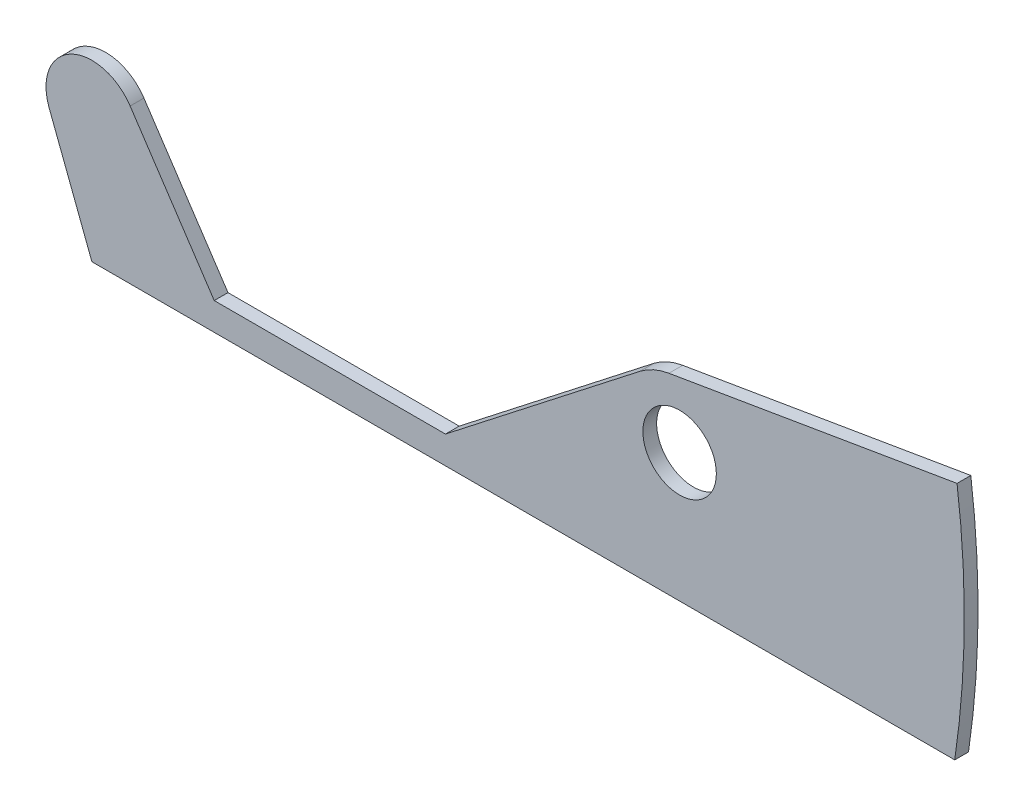
ISO-10303-21;
HEADER;
FILE_DESCRIPTION(('STEP AP214'),'2;1');
FILE_NAME('part.step','',(''),(''),'','','');
FILE_SCHEMA(('AUTOMOTIVE_DESIGN { 1 0 10303 214 1 1 1 1 }'));
ENDSEC;
DATA;
#1=APPLICATION_CONTEXT('core data for automotive mechanical design processes');
#2=APPLICATION_PROTOCOL_DEFINITION('international standard','automotive_design',2000,#1);
#3=PRODUCT_CONTEXT('',#1,'mechanical');
#4=PRODUCT('Part','Part','',(#3));
#5=PRODUCT_RELATED_PRODUCT_CATEGORY('part','',(#4));
#6=PRODUCT_DEFINITION_FORMATION('','',#4);
#7=PRODUCT_DEFINITION_CONTEXT('part definition',#1,'design');
#8=PRODUCT_DEFINITION('design','',#6,#7);
#9=PRODUCT_DEFINITION_SHAPE('','',#8);
#10=(LENGTH_UNIT() NAMED_UNIT(*) SI_UNIT(.MILLI.,.METRE.));
#11=(NAMED_UNIT(*) PLANE_ANGLE_UNIT() SI_UNIT($,.RADIAN.));
#12=(NAMED_UNIT(*) SI_UNIT($,.STERADIAN.) SOLID_ANGLE_UNIT());
#13=UNCERTAINTY_MEASURE_WITH_UNIT(LENGTH_MEASURE(1.E-05),#10,'distance_accuracy_value','');
#14=(GEOMETRIC_REPRESENTATION_CONTEXT(3) GLOBAL_UNCERTAINTY_ASSIGNED_CONTEXT((#13)) GLOBAL_UNIT_ASSIGNED_CONTEXT((#10,
#11,#12)) REPRESENTATION_CONTEXT('',''));
#15=CARTESIAN_POINT('',(0.,0.,0.));
#16=DIRECTION('',(0.,0.,1.));
#17=DIRECTION('',(1.,0.,0.));
#18=AXIS2_PLACEMENT_3D('',#15,#16,#17);
#19=CARTESIAN_POINT('',(0.,0.,3.));
#20=DIRECTION('',(0.,0.,1.));
#21=DIRECTION('',(1.,0.,0.));
#22=AXIS2_PLACEMENT_3D('',#19,#20,#21);
#23=PLANE('',#22);
#24=CARTESIAN_POINT('',(0.,0.,3.));
#25=DIRECTION('',(0.,0.,1.));
#26=DIRECTION('',(1.,0.,0.));
#27=AXIS2_PLACEMENT_3D('',#24,#25,#26);
#28=CIRCLE('',#27,10.);
#29=CARTESIAN_POINT('',(8.32658342257578,5.53787039455478,3.));
#30=VERTEX_POINT('',#29);
#31=CARTESIAN_POINT('',(-9.34049773615859,-3.57142857142857,3.));
#32=VERTEX_POINT('',#31);
#33=EDGE_CURVE('E155',#30,#32,#28,.T.);
#34=ORIENTED_EDGE('',*,*,#33,.T.);
#35=DIRECTION('',(0.357142857142857,-0.934049773615859,0.));
#36=VECTOR('',#35,1.);
#37=CARTESIAN_POINT('',(-9.34049773615859,-3.57142857142857,3.));
#38=LINE('',#37,#36);
#39=CARTESIAN_POINT('',(0.,-28.,3.));
#40=VERTEX_POINT('',#39);
#41=EDGE_CURVE('E98',#32,#40,#38,.T.);
#42=ORIENTED_EDGE('',*,*,#41,.T.);
#43=DIRECTION('',(1.,0.,0.));
#44=VECTOR('',#43,1.);
#45=CARTESIAN_POINT('',(0.,-28.,3.));
#46=LINE('',#45,#44);
#47=CARTESIAN_POINT('',(187.92551716039,-28.,3.));
#48=VERTEX_POINT('',#47);
#49=EDGE_CURVE('E173',#40,#48,#46,.T.);
#50=ORIENTED_EDGE('',*,*,#49,.T.);
#51=CARTESIAN_POINT('',(0.,0.,3.));
#52=DIRECTION('',(0.,0.,1.));
#53=DIRECTION('',(1.,0.,0.));
#54=AXIS2_PLACEMENT_3D('',#51,#52,#53);
#55=CIRCLE('',#54,190.);
#56=CARTESIAN_POINT('',(188.425560886423,24.409178696484,3.));
#57=VERTEX_POINT('',#56);
#58=EDGE_CURVE('E190',#48,#57,#55,.T.);
#59=ORIENTED_EDGE('',*,*,#58,.T.);
#60=DIRECTION('',(-0.986021549791121,-0.166617836222647,0.));
#61=VECTOR('',#60,1.);
#62=CARTESIAN_POINT('',(125.667350292883,13.8043016970757,3.));
#63=LINE('',#62,#61);
#64=CARTESIAN_POINT('',(125.667350292883,13.8043016970757,3.));
#65=VERTEX_POINT('',#64);
#66=EDGE_CURVE('E189',#57,#65,#63,.T.);
#67=ORIENTED_EDGE('',*,*,#66,.T.);
#68=CARTESIAN_POINT('',(128.,0.,3.));
#69=DIRECTION('',(0.,0.,1.));
#70=DIRECTION('',(1.,0.,0.));
#71=AXIS2_PLACEMENT_3D('',#68,#69,#70);
#72=CIRCLE('',#71,14.);
#73=CARTESIAN_POINT('',(119.393575063448,11.0421668983714,3.));
#74=VERTEX_POINT('',#73);
#75=EDGE_CURVE('E120',#65,#74,#72,.T.);
#76=ORIENTED_EDGE('',*,*,#75,.T.);
#77=DIRECTION('',(-0.78872620702653,-0.61474463832517,0.));
#78=VECTOR('',#77,1.);
#79=CARTESIAN_POINT('',(119.393575063448,11.0421668983714,3.));
#80=LINE('',#79,#78);
#81=CARTESIAN_POINT('',(77.,-22.,3.));
#82=VERTEX_POINT('',#81);
#83=EDGE_CURVE('E114',#74,#82,#80,.T.);
#84=ORIENTED_EDGE('',*,*,#83,.T.);
#85=DIRECTION('',(-1.,0.,0.));
#86=VECTOR('',#85,1.);
#87=CARTESIAN_POINT('',(77.,-22.,3.));
#88=LINE('',#87,#86);
#89=CARTESIAN_POINT('',(26.641557217664,-22.,3.));
#90=VERTEX_POINT('',#89);
#91=EDGE_CURVE('E118',#82,#90,#88,.T.);
#92=ORIENTED_EDGE('',*,*,#91,.T.);
#93=DIRECTION('',(-0.553787039455478,0.832658342257577,0.));
#94=VECTOR('',#93,1.);
#95=CARTESIAN_POINT('',(8.32658342257578,5.53787039455478,3.));
#96=LINE('',#95,#94);
#97=EDGE_CURVE('E52',#90,#30,#96,.T.);
#98=ORIENTED_EDGE('',*,*,#97,.T.);
#99=EDGE_LOOP('',(#34,#42,#50,#59,#67,#76,#84,#92,#98));
#100=FACE_BOUND('',#99,.T.);
#101=CARTESIAN_POINT('',(128.,0.,3.));
#102=DIRECTION('',(0.,0.,1.));
#103=DIRECTION('',(1.,0.,0.));
#104=AXIS2_PLACEMENT_3D('',#101,#102,#103);
#105=CIRCLE('',#104,8.00000000000001);
#106=CARTESIAN_POINT('',(136.,0.,3.));
#107=VERTEX_POINT('',#106);
#108=EDGE_CURVE('E142',#107,#107,#105,.T.);
#109=ORIENTED_EDGE('',*,*,#108,.F.);
#110=EDGE_LOOP('',(#109));
#111=FACE_BOUND('',#110,.T.);
#112=ADVANCED_FACE('F35',(#100,#111),#23,.T.);
#113=CARTESIAN_POINT('',(0.,0.,0.));
#114=DIRECTION('',(0.,0.,1.));
#115=DIRECTION('',(1.,0.,0.));
#116=AXIS2_PLACEMENT_3D('',#113,#114,#115);
#117=PLANE('',#116);
#118=CARTESIAN_POINT('',(0.,0.,0.));
#119=DIRECTION('',(0.,0.,1.));
#120=DIRECTION('',(1.,0.,0.));
#121=AXIS2_PLACEMENT_3D('',#118,#119,#120);
#122=CIRCLE('',#121,10.);
#123=CARTESIAN_POINT('',(8.32658342257578,5.53787039455478,0.));
#124=VERTEX_POINT('',#123);
#125=CARTESIAN_POINT('',(-9.34049773615859,-3.57142857142857,0.));
#126=VERTEX_POINT('',#125);
#127=EDGE_CURVE('E138',#124,#126,#122,.T.);
#128=ORIENTED_EDGE('',*,*,#127,.F.);
#129=DIRECTION('',(-0.553787039455478,0.832658342257577,0.));
#130=VECTOR('',#129,1.);
#131=CARTESIAN_POINT('',(8.32658342257578,5.53787039455478,0.));
#132=LINE('',#131,#130);
#133=CARTESIAN_POINT('',(26.641557217664,-22.,0.));
#134=VERTEX_POINT('',#133);
#135=EDGE_CURVE('E90',#134,#124,#132,.T.);
#136=ORIENTED_EDGE('',*,*,#135,.F.);
#137=DIRECTION('',(-1.,0.,0.));
#138=VECTOR('',#137,1.);
#139=CARTESIAN_POINT('',(77.,-22.,0.));
#140=LINE('',#139,#138);
#141=CARTESIAN_POINT('',(77.,-22.,0.));
#142=VERTEX_POINT('',#141);
#143=EDGE_CURVE('E84',#142,#134,#140,.T.);
#144=ORIENTED_EDGE('',*,*,#143,.F.);
#145=DIRECTION('',(-0.78872620702653,-0.61474463832517,0.));
#146=VECTOR('',#145,1.);
#147=CARTESIAN_POINT('',(119.393575063448,11.0421668983714,0.));
#148=LINE('',#147,#146);
#149=CARTESIAN_POINT('',(119.393575063448,11.0421668983714,0.));
#150=VERTEX_POINT('',#149);
#151=EDGE_CURVE('E128',#150,#142,#148,.T.);
#152=ORIENTED_EDGE('',*,*,#151,.F.);
#153=CARTESIAN_POINT('',(128.,0.,0.));
#154=DIRECTION('',(0.,0.,1.));
#155=DIRECTION('',(1.,0.,0.));
#156=AXIS2_PLACEMENT_3D('',#153,#154,#155);
#157=CIRCLE('',#156,14.);
#158=CARTESIAN_POINT('',(125.667350292883,13.8043016970757,0.));
#159=VERTEX_POINT('',#158);
#160=EDGE_CURVE('E150',#159,#150,#157,.T.);
#161=ORIENTED_EDGE('',*,*,#160,.F.);
#162=DIRECTION('',(-0.986021549791121,-0.166617836222647,0.));
#163=VECTOR('',#162,1.);
#164=CARTESIAN_POINT('',(125.667350292883,13.8043016970757,0.));
#165=LINE('',#164,#163);
#166=CARTESIAN_POINT('',(188.425560886423,24.409178696484,0.));
#167=VERTEX_POINT('',#166);
#168=EDGE_CURVE('E148',#167,#159,#165,.T.);
#169=ORIENTED_EDGE('',*,*,#168,.F.);
#170=CARTESIAN_POINT('',(0.,0.,0.));
#171=DIRECTION('',(0.,0.,1.));
#172=DIRECTION('',(1.,0.,0.));
#173=AXIS2_PLACEMENT_3D('',#170,#171,#172);
#174=CIRCLE('',#173,190.);
#175=CARTESIAN_POINT('',(187.92551716039,-28.,0.));
#176=VERTEX_POINT('',#175);
#177=EDGE_CURVE('E146',#176,#167,#174,.T.);
#178=ORIENTED_EDGE('',*,*,#177,.F.);
#179=DIRECTION('',(1.,0.,0.));
#180=VECTOR('',#179,1.);
#181=CARTESIAN_POINT('',(0.,-28.,0.));
#182=LINE('',#181,#180);
#183=CARTESIAN_POINT('',(0.,-28.,0.));
#184=VERTEX_POINT('',#183);
#185=EDGE_CURVE('E144',#184,#176,#182,.T.);
#186=ORIENTED_EDGE('',*,*,#185,.F.);
#187=DIRECTION('',(0.357142857142857,-0.934049773615859,0.));
#188=VECTOR('',#187,1.);
#189=CARTESIAN_POINT('',(-9.34049773615859,-3.57142857142857,0.));
#190=LINE('',#189,#188);
#191=EDGE_CURVE('E141',#126,#184,#190,.T.);
#192=ORIENTED_EDGE('',*,*,#191,.F.);
#193=EDGE_LOOP('',(#128,#136,#144,#152,#161,#169,#178,#186,#192));
#194=FACE_BOUND('',#193,.T.);
#195=CARTESIAN_POINT('',(128.,0.,0.));
#196=DIRECTION('',(0.,0.,1.));
#197=DIRECTION('',(1.,0.,0.));
#198=AXIS2_PLACEMENT_3D('',#195,#196,#197);
#199=CIRCLE('',#198,8.00000000000001);
#200=CARTESIAN_POINT('',(136.,0.,0.));
#201=VERTEX_POINT('',#200);
#202=EDGE_CURVE('E197',#201,#201,#199,.T.);
#203=ORIENTED_EDGE('',*,*,#202,.T.);
#204=EDGE_LOOP('',(#203));
#205=FACE_BOUND('',#204,.T.);
#206=ADVANCED_FACE('F177',(#194,#205),#117,.F.);
#207=CARTESIAN_POINT('',(0.,0.,3.));
#208=DIRECTION('',(0.,0.,-1.));
#209=DIRECTION('',(-1.,0.,0.));
#210=AXIS2_PLACEMENT_3D('',#207,#208,#209);
#211=CYLINDRICAL_SURFACE('',#210,10.);
#212=ORIENTED_EDGE('',*,*,#127,.T.);
#213=DIRECTION('',(0.,0.,-1.));
#214=VECTOR('',#213,1.);
#215=CARTESIAN_POINT('',(-9.34049773615859,-3.57142857142857,3.));
#216=LINE('',#215,#214);
#217=EDGE_CURVE('E11',#32,#126,#216,.T.);
#218=ORIENTED_EDGE('',*,*,#217,.F.);
#219=ORIENTED_EDGE('',*,*,#33,.F.);
#220=DIRECTION('',(0.,0.,-1.));
#221=VECTOR('',#220,1.);
#222=CARTESIAN_POINT('',(8.32658342257578,5.53787039455478,3.));
#223=LINE('',#222,#221);
#224=EDGE_CURVE('E134',#30,#124,#223,.T.);
#225=ORIENTED_EDGE('',*,*,#224,.T.);
#226=EDGE_LOOP('',(#212,#218,#219,#225));
#227=FACE_BOUND('',#226,.T.);
#228=ADVANCED_FACE('F37',(#227),#211,.T.);
#229=CARTESIAN_POINT('',(-9.34049773615859,-3.57142857142857,3.));
#230=DIRECTION('',(0.934049773615859,0.357142857142857,0.));
#231=DIRECTION('',(-0.357142857142857,0.934049773615859,0.));
#232=AXIS2_PLACEMENT_3D('',#229,#230,#231);
#233=PLANE('',#232);
#234=ORIENTED_EDGE('',*,*,#191,.T.);
#235=DIRECTION('',(0.,0.,-1.));
#236=VECTOR('',#235,1.);
#237=CARTESIAN_POINT('',(0.,-28.,3.));
#238=LINE('',#237,#236);
#239=EDGE_CURVE('E44',#40,#184,#238,.T.);
#240=ORIENTED_EDGE('',*,*,#239,.F.);
#241=ORIENTED_EDGE('',*,*,#41,.F.);
#242=ORIENTED_EDGE('',*,*,#217,.T.);
#243=EDGE_LOOP('',(#234,#240,#241,#242));
#244=FACE_BOUND('',#243,.T.);
#245=ADVANCED_FACE('F229',(#244),#233,.F.);
#246=CARTESIAN_POINT('',(0.,-28.,3.));
#247=DIRECTION('',(0.,1.,0.));
#248=DIRECTION('',(0.,0.,1.));
#249=AXIS2_PLACEMENT_3D('',#246,#247,#248);
#250=PLANE('',#249);
#251=ORIENTED_EDGE('',*,*,#185,.T.);
#252=DIRECTION('',(0.,0.,-1.));
#253=VECTOR('',#252,1.);
#254=CARTESIAN_POINT('',(187.92551716039,-28.,3.));
#255=LINE('',#254,#253);
#256=EDGE_CURVE('E165',#48,#176,#255,.T.);
#257=ORIENTED_EDGE('',*,*,#256,.F.);
#258=ORIENTED_EDGE('',*,*,#49,.F.);
#259=ORIENTED_EDGE('',*,*,#239,.T.);
#260=EDGE_LOOP('',(#251,#257,#258,#259));
#261=FACE_BOUND('',#260,.T.);
#262=ADVANCED_FACE('F171',(#261),#250,.F.);
#263=CARTESIAN_POINT('',(0.,0.,3.));
#264=DIRECTION('',(0.,0.,-1.));
#265=DIRECTION('',(-1.,0.,0.));
#266=AXIS2_PLACEMENT_3D('',#263,#264,#265);
#267=CYLINDRICAL_SURFACE('',#266,190.);
#268=ORIENTED_EDGE('',*,*,#177,.T.);
#269=DIRECTION('',(0.,0.,-1.));
#270=VECTOR('',#269,1.);
#271=CARTESIAN_POINT('',(188.425560886423,24.409178696484,3.));
#272=LINE('',#271,#270);
#273=EDGE_CURVE('E162',#57,#167,#272,.T.);
#274=ORIENTED_EDGE('',*,*,#273,.F.);
#275=ORIENTED_EDGE('',*,*,#58,.F.);
#276=ORIENTED_EDGE('',*,*,#256,.T.);
#277=EDGE_LOOP('',(#268,#274,#275,#276));
#278=FACE_BOUND('',#277,.T.);
#279=ADVANCED_FACE('F183',(#278),#267,.T.);
#280=CARTESIAN_POINT('',(125.667350292883,13.8043016970757,3.));
#281=DIRECTION('',(0.166617836222647,-0.986021549791121,0.));
#282=DIRECTION('',(0.986021549791121,0.166617836222647,0.));
#283=AXIS2_PLACEMENT_3D('',#280,#281,#282);
#284=PLANE('',#283);
#285=ORIENTED_EDGE('',*,*,#168,.T.);
#286=DIRECTION('',(0.,0.,-1.));
#287=VECTOR('',#286,1.);
#288=CARTESIAN_POINT('',(125.667350292883,13.8043016970757,3.));
#289=LINE('',#288,#287);
#290=EDGE_CURVE('E159',#65,#159,#289,.T.);
#291=ORIENTED_EDGE('',*,*,#290,.F.);
#292=ORIENTED_EDGE('',*,*,#66,.F.);
#293=ORIENTED_EDGE('',*,*,#273,.T.);
#294=EDGE_LOOP('',(#285,#291,#292,#293));
#295=FACE_BOUND('',#294,.T.);
#296=ADVANCED_FACE('F187',(#295),#284,.F.);
#297=CARTESIAN_POINT('',(128.,0.,3.));
#298=DIRECTION('',(0.,0.,-1.));
#299=DIRECTION('',(-1.,0.,0.));
#300=AXIS2_PLACEMENT_3D('',#297,#298,#299);
#301=CYLINDRICAL_SURFACE('',#300,14.);
#302=ORIENTED_EDGE('',*,*,#160,.T.);
#303=DIRECTION('',(0.,0.,-1.));
#304=VECTOR('',#303,1.);
#305=CARTESIAN_POINT('',(119.393575063448,11.0421668983714,3.));
#306=LINE('',#305,#304);
#307=EDGE_CURVE('E129',#74,#150,#306,.T.);
#308=ORIENTED_EDGE('',*,*,#307,.F.);
#309=ORIENTED_EDGE('',*,*,#75,.F.);
#310=ORIENTED_EDGE('',*,*,#290,.T.);
#311=EDGE_LOOP('',(#302,#308,#309,#310));
#312=FACE_BOUND('',#311,.T.);
#313=ADVANCED_FACE('F220',(#312),#301,.T.);
#314=CARTESIAN_POINT('',(119.393575063448,11.0421668983714,3.));
#315=DIRECTION('',(0.61474463832517,-0.78872620702653,0.));
#316=DIRECTION('',(0.78872620702653,0.61474463832517,0.));
#317=AXIS2_PLACEMENT_3D('',#314,#315,#316);
#318=PLANE('',#317);
#319=ORIENTED_EDGE('',*,*,#151,.T.);
#320=DIRECTION('',(0.,0.,-1.));
#321=VECTOR('',#320,1.);
#322=CARTESIAN_POINT('',(77.,-22.,3.));
#323=LINE('',#322,#321);
#324=EDGE_CURVE('E125',#82,#142,#323,.T.);
#325=ORIENTED_EDGE('',*,*,#324,.F.);
#326=ORIENTED_EDGE('',*,*,#83,.F.);
#327=ORIENTED_EDGE('',*,*,#307,.T.);
#328=EDGE_LOOP('',(#319,#325,#326,#327));
#329=FACE_BOUND('',#328,.T.);
#330=ADVANCED_FACE('F126',(#329),#318,.F.);
#331=CARTESIAN_POINT('',(77.,-22.,3.));
#332=DIRECTION('',(0.,-1.,0.));
#333=DIRECTION('',(0.,0.,-1.));
#334=AXIS2_PLACEMENT_3D('',#331,#332,#333);
#335=PLANE('',#334);
#336=ORIENTED_EDGE('',*,*,#143,.T.);
#337=DIRECTION('',(0.,0.,-1.));
#338=VECTOR('',#337,1.);
#339=CARTESIAN_POINT('',(26.641557217664,-22.,3.));
#340=LINE('',#339,#338);
#341=EDGE_CURVE('E130',#90,#134,#340,.T.);
#342=ORIENTED_EDGE('',*,*,#341,.F.);
#343=ORIENTED_EDGE('',*,*,#91,.F.);
#344=ORIENTED_EDGE('',*,*,#324,.T.);
#345=EDGE_LOOP('',(#336,#342,#343,#344));
#346=FACE_BOUND('',#345,.T.);
#347=ADVANCED_FACE('F132',(#346),#335,.F.);
#348=CARTESIAN_POINT('',(8.32658342257578,5.53787039455478,3.));
#349=DIRECTION('',(-0.832658342257577,-0.553787039455478,0.));
#350=DIRECTION('',(0.553787039455478,-0.832658342257577,0.));
#351=AXIS2_PLACEMENT_3D('',#348,#349,#350);
#352=PLANE('',#351);
#353=ORIENTED_EDGE('',*,*,#135,.T.);
#354=ORIENTED_EDGE('',*,*,#224,.F.);
#355=ORIENTED_EDGE('',*,*,#97,.F.);
#356=ORIENTED_EDGE('',*,*,#341,.T.);
#357=EDGE_LOOP('',(#353,#354,#355,#356));
#358=FACE_BOUND('',#357,.T.);
#359=ADVANCED_FACE('F213',(#358),#352,.F.);
#360=CARTESIAN_POINT('',(128.,0.,3.));
#361=DIRECTION('',(0.,0.,-1.));
#362=DIRECTION('',(-1.,0.,0.));
#363=AXIS2_PLACEMENT_3D('',#360,#361,#362);
#364=CYLINDRICAL_SURFACE('',#363,8.00000000000001);
#365=ORIENTED_EDGE('',*,*,#108,.T.);
#366=EDGE_LOOP('',(#365));
#367=FACE_BOUND('',#366,.T.);
#368=ORIENTED_EDGE('',*,*,#202,.F.);
#369=EDGE_LOOP('',(#368));
#370=FACE_BOUND('',#369,.T.);
#371=ADVANCED_FACE('F203',(#367,#370),#364,.F.);
#372=CLOSED_SHELL('',(#112,#206,#228,#245,#262,#279,#296,#313,#330,#347,#359,#371));
#373=MANIFOLD_SOLID_BREP('B2',#372);
#374=ADVANCED_BREP_SHAPE_REPRESENTATION('',(#18,#373),#14);
#375=SHAPE_DEFINITION_REPRESENTATION(#9,#374);
ENDSEC;
END-ISO-10303-21;
